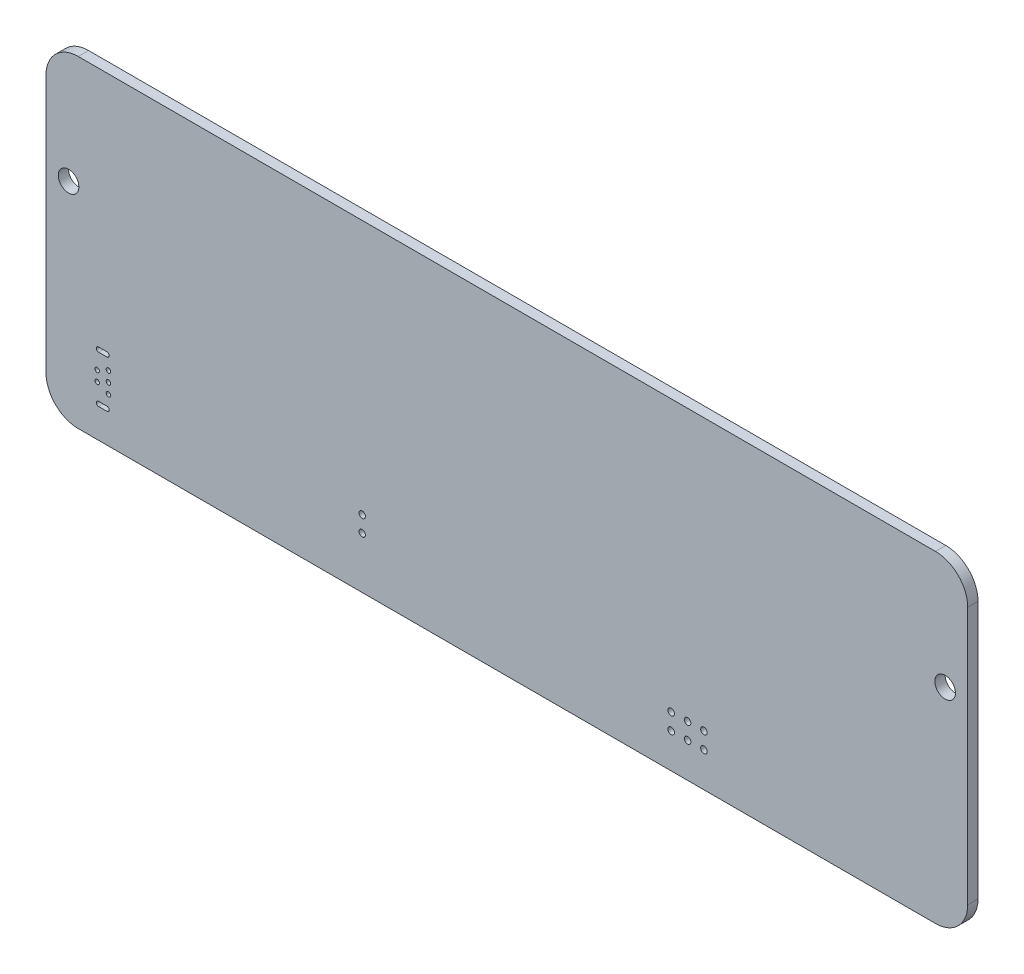
ISO-10303-21;
HEADER;
FILE_DESCRIPTION(('STEP AP214'),'2;1');
FILE_NAME('part.step','',(''),(''),'','','');
FILE_SCHEMA(('AUTOMOTIVE_DESIGN { 1 0 10303 214 1 1 1 1 }'));
ENDSEC;
DATA;
#1=APPLICATION_CONTEXT('core data for automotive mechanical design processes');
#2=APPLICATION_PROTOCOL_DEFINITION('international standard','automotive_design',2000,#1);
#3=PRODUCT_CONTEXT('',#1,'mechanical');
#4=PRODUCT('Part','Part','',(#3));
#5=PRODUCT_RELATED_PRODUCT_CATEGORY('part','',(#4));
#6=PRODUCT_DEFINITION_FORMATION('','',#4);
#7=PRODUCT_DEFINITION_CONTEXT('part definition',#1,'design');
#8=PRODUCT_DEFINITION('design','',#6,#7);
#9=PRODUCT_DEFINITION_SHAPE('','',#8);
#10=(LENGTH_UNIT() NAMED_UNIT(*) SI_UNIT(.MILLI.,.METRE.));
#11=(NAMED_UNIT(*) PLANE_ANGLE_UNIT() SI_UNIT($,.RADIAN.));
#12=(NAMED_UNIT(*) SI_UNIT($,.STERADIAN.) SOLID_ANGLE_UNIT());
#13=UNCERTAINTY_MEASURE_WITH_UNIT(LENGTH_MEASURE(1.E-05),#10,'distance_accuracy_value','');
#14=(GEOMETRIC_REPRESENTATION_CONTEXT(3) GLOBAL_UNCERTAINTY_ASSIGNED_CONTEXT((#13)) GLOBAL_UNIT_ASSIGNED_CONTEXT((#10,
#11,#12)) REPRESENTATION_CONTEXT('',''));
#15=CARTESIAN_POINT('',(0.,0.,0.));
#16=DIRECTION('',(0.,0.,1.));
#17=DIRECTION('',(1.,0.,0.));
#18=AXIS2_PLACEMENT_3D('',#15,#16,#17);
#19=CARTESIAN_POINT('',(59.465,-95.1025,0.));
#20=DIRECTION('',(0.,0.,-1.));
#21=DIRECTION('',(-1.,0.,0.));
#22=AXIS2_PLACEMENT_3D('',#19,#20,#21);
#23=CYLINDRICAL_SURFACE('',#22,0.35);
#24=CARTESIAN_POINT('',(59.465,-95.1025,1.6));
#25=DIRECTION('',(0.,0.,-1.));
#26=DIRECTION('',(-1.,0.,0.));
#27=AXIS2_PLACEMENT_3D('',#24,#25,#26);
#28=CIRCLE('',#27,0.35);
#29=CARTESIAN_POINT('',(59.465,-94.7525,1.6));
#30=VERTEX_POINT('',#29);
#31=CARTESIAN_POINT('',(59.465,-95.4525,1.6));
#32=VERTEX_POINT('',#31);
#33=EDGE_CURVE('E139',#30,#32,#28,.T.);
#34=ORIENTED_EDGE('',*,*,#33,.F.);
#35=DIRECTION('',(0.,0.,-1.));
#36=VECTOR('',#35,1.);
#37=CARTESIAN_POINT('',(59.465,-94.7525,0.));
#38=LINE('',#37,#36);
#39=CARTESIAN_POINT('',(59.465,-94.7525,0.));
#40=VERTEX_POINT('',#39);
#41=EDGE_CURVE('E134',#40,#30,#38,.F.);
#42=ORIENTED_EDGE('',*,*,#41,.F.);
#43=CARTESIAN_POINT('',(59.465,-95.1025,0.));
#44=DIRECTION('',(0.,0.,-1.));
#45=DIRECTION('',(-1.,0.,0.));
#46=AXIS2_PLACEMENT_3D('',#43,#44,#45);
#47=CIRCLE('',#46,0.35);
#48=CARTESIAN_POINT('',(59.465,-95.4525,0.));
#49=VERTEX_POINT('',#48);
#50=EDGE_CURVE('E19',#49,#40,#47,.F.);
#51=ORIENTED_EDGE('',*,*,#50,.F.);
#52=DIRECTION('',(0.,0.,1.));
#53=VECTOR('',#52,1.);
#54=CARTESIAN_POINT('',(59.465,-95.4525,0.));
#55=LINE('',#54,#53);
#56=EDGE_CURVE('E153',#32,#49,#55,.F.);
#57=ORIENTED_EDGE('',*,*,#56,.F.);
#58=EDGE_LOOP('',(#34,#42,#51,#57));
#59=FACE_BOUND('',#58,.T.);
#60=ADVANCED_FACE('F16',(#59),#23,.F.);
#61=CARTESIAN_POINT('',(58.165,-87.8025,0.));
#62=DIRECTION('',(0.,0.,-1.));
#63=DIRECTION('',(-1.,0.,0.));
#64=AXIS2_PLACEMENT_3D('',#61,#62,#63);
#65=CYLINDRICAL_SURFACE('',#64,0.35);
#66=CARTESIAN_POINT('',(58.165,-87.8025,1.6));
#67=DIRECTION('',(0.,0.,-1.));
#68=DIRECTION('',(-1.,0.,0.));
#69=AXIS2_PLACEMENT_3D('',#66,#67,#68);
#70=CIRCLE('',#69,0.35);
#71=CARTESIAN_POINT('',(58.165,-88.1525,1.6));
#72=VERTEX_POINT('',#71);
#73=CARTESIAN_POINT('',(58.165,-87.4525,1.6));
#74=VERTEX_POINT('',#73);
#75=EDGE_CURVE('E147',#72,#74,#70,.T.);
#76=ORIENTED_EDGE('',*,*,#75,.F.);
#77=DIRECTION('',(0.,0.,1.));
#78=VECTOR('',#77,1.);
#79=CARTESIAN_POINT('',(58.165,-88.1525,0.));
#80=LINE('',#79,#78);
#81=CARTESIAN_POINT('',(58.165,-88.1525,0.));
#82=VERTEX_POINT('',#81);
#83=EDGE_CURVE('E195',#82,#72,#80,.T.);
#84=ORIENTED_EDGE('',*,*,#83,.F.);
#85=CARTESIAN_POINT('',(58.165,-87.8025,0.));
#86=DIRECTION('',(0.,0.,-1.));
#87=DIRECTION('',(-1.,0.,0.));
#88=AXIS2_PLACEMENT_3D('',#85,#86,#87);
#89=CIRCLE('',#88,0.35);
#90=CARTESIAN_POINT('',(58.165,-87.4525,0.));
#91=VERTEX_POINT('',#90);
#92=EDGE_CURVE('E326',#91,#82,#89,.F.);
#93=ORIENTED_EDGE('',*,*,#92,.F.);
#94=DIRECTION('',(0.,0.,-1.));
#95=VECTOR('',#94,1.);
#96=CARTESIAN_POINT('',(58.165,-87.4525,0.));
#97=LINE('',#96,#95);
#98=EDGE_CURVE('E199',#74,#91,#97,.T.);
#99=ORIENTED_EDGE('',*,*,#98,.F.);
#100=EDGE_LOOP('',(#76,#84,#93,#99));
#101=FACE_BOUND('',#100,.T.);
#102=ADVANCED_FACE('F339',(#101),#65,.F.);
#103=CARTESIAN_POINT('',(59.465,-87.8025,0.));
#104=DIRECTION('',(0.,0.,-1.));
#105=DIRECTION('',(-1.,0.,0.));
#106=AXIS2_PLACEMENT_3D('',#103,#104,#105);
#107=CYLINDRICAL_SURFACE('',#106,0.35);
#108=CARTESIAN_POINT('',(59.465,-87.8025,1.6));
#109=DIRECTION('',(0.,0.,-1.));
#110=DIRECTION('',(-1.,0.,0.));
#111=AXIS2_PLACEMENT_3D('',#108,#109,#110);
#112=CIRCLE('',#111,0.35);
#113=CARTESIAN_POINT('',(59.465,-87.4525,1.6));
#114=VERTEX_POINT('',#113);
#115=CARTESIAN_POINT('',(59.465,-88.1525,1.6));
#116=VERTEX_POINT('',#115);
#117=EDGE_CURVE('E207',#114,#116,#112,.T.);
#118=ORIENTED_EDGE('',*,*,#117,.F.);
#119=DIRECTION('',(0.,0.,-1.));
#120=VECTOR('',#119,1.);
#121=CARTESIAN_POINT('',(59.465,-87.4525,0.));
#122=LINE('',#121,#120);
#123=CARTESIAN_POINT('',(59.465,-87.4525,0.));
#124=VERTEX_POINT('',#123);
#125=EDGE_CURVE('E200',#124,#114,#122,.F.);
#126=ORIENTED_EDGE('',*,*,#125,.F.);
#127=CARTESIAN_POINT('',(59.465,-87.8025,0.));
#128=DIRECTION('',(0.,0.,-1.));
#129=DIRECTION('',(-1.,0.,0.));
#130=AXIS2_PLACEMENT_3D('',#127,#128,#129);
#131=CIRCLE('',#130,0.35);
#132=CARTESIAN_POINT('',(59.465,-88.1525,0.));
#133=VERTEX_POINT('',#132);
#134=EDGE_CURVE('E34',#133,#124,#131,.F.);
#135=ORIENTED_EDGE('',*,*,#134,.F.);
#136=DIRECTION('',(0.,0.,1.));
#137=VECTOR('',#136,1.);
#138=CARTESIAN_POINT('',(59.465,-88.1525,0.));
#139=LINE('',#138,#137);
#140=EDGE_CURVE('E194',#116,#133,#139,.F.);
#141=ORIENTED_EDGE('',*,*,#140,.F.);
#142=EDGE_LOOP('',(#118,#126,#135,#141));
#143=FACE_BOUND('',#142,.T.);
#144=ADVANCED_FACE('F424',(#143),#107,.F.);
#145=CARTESIAN_POINT('',(121.5,-75.,1.6));
#146=DIRECTION('',(0.,0.,1.));
#147=DIRECTION('',(1.,0.,0.));
#148=AXIS2_PLACEMENT_3D('',#145,#146,#147);
#149=PLANE('',#148);
#150=CARTESIAN_POINT('',(53.5,-67.5,1.6));
#151=DIRECTION('',(0.,0.,-1.));
#152=DIRECTION('',(-1.,0.,0.));
#153=AXIS2_PLACEMENT_3D('',#150,#151,#152);
#154=CIRCLE('',#153,1.6);
#155=CARTESIAN_POINT('',(51.9,-67.5,1.6));
#156=VERTEX_POINT('',#155);
#157=EDGE_CURVE('E275',#156,#156,#154,.T.);
#158=ORIENTED_EDGE('',*,*,#157,.T.);
#159=EDGE_LOOP('',(#158));
#160=FACE_BOUND('',#159,.T.);
#161=CARTESIAN_POINT('',(189.5,-67.5,1.6));
#162=DIRECTION('',(0.,0.,-1.));
#163=DIRECTION('',(-1.,0.,0.));
#164=AXIS2_PLACEMENT_3D('',#161,#162,#163);
#165=CIRCLE('',#164,1.6);
#166=CARTESIAN_POINT('',(187.9,-67.5,1.6));
#167=VERTEX_POINT('',#166);
#168=EDGE_CURVE('E278',#167,#167,#165,.T.);
#169=ORIENTED_EDGE('',*,*,#168,.T.);
#170=EDGE_LOOP('',(#169));
#171=FACE_BOUND('',#170,.T.);
#172=ORIENTED_EDGE('',*,*,#117,.T.);
#173=DIRECTION('',(1.,0.,0.));
#174=VECTOR('',#173,1.);
#175=CARTESIAN_POINT('',(58.165,-88.1525,1.6));
#176=LINE('',#175,#174);
#177=EDGE_CURVE('E191',#72,#116,#176,.T.);
#178=ORIENTED_EDGE('',*,*,#177,.F.);
#179=ORIENTED_EDGE('',*,*,#75,.T.);
#180=DIRECTION('',(1.,0.,0.));
#181=VECTOR('',#180,1.);
#182=CARTESIAN_POINT('',(59.465,-87.4525,1.6));
#183=LINE('',#182,#181);
#184=EDGE_CURVE('E196',#114,#74,#183,.F.);
#185=ORIENTED_EDGE('',*,*,#184,.F.);
#186=EDGE_LOOP('',(#172,#178,#179,#185));
#187=FACE_BOUND('',#186,.T.);
#188=CARTESIAN_POINT('',(99.06,-89.535,1.6));
#189=DIRECTION('',(0.,0.,1.));
#190=DIRECTION('',(1.,0.,0.));
#191=AXIS2_PLACEMENT_3D('',#188,#189,#190);
#192=CIRCLE('',#191,0.5);
#193=CARTESIAN_POINT('',(99.56,-89.535,1.6));
#194=VERTEX_POINT('',#193);
#195=EDGE_CURVE('E306',#194,#194,#192,.F.);
#196=ORIENTED_EDGE('',*,*,#195,.T.);
#197=EDGE_LOOP('',(#196));
#198=FACE_BOUND('',#197,.T.);
#199=CARTESIAN_POINT('',(57.94,-90.6525,1.6));
#200=DIRECTION('',(0.,0.,1.));
#201=DIRECTION('',(1.,0.,0.));
#202=AXIS2_PLACEMENT_3D('',#199,#200,#201);
#203=CIRCLE('',#202,0.35);
#204=CARTESIAN_POINT('',(58.29,-90.6525,1.6));
#205=VERTEX_POINT('',#204);
#206=EDGE_CURVE('E300',#205,#205,#203,.F.);
#207=ORIENTED_EDGE('',*,*,#206,.T.);
#208=EDGE_LOOP('',(#207));
#209=FACE_BOUND('',#208,.T.);
#210=CARTESIAN_POINT('',(59.69,-89.8525,1.6));
#211=DIRECTION('',(0.,0.,1.));
#212=DIRECTION('',(1.,0.,0.));
#213=AXIS2_PLACEMENT_3D('',#210,#211,#212);
#214=CIRCLE('',#213,0.35);
#215=CARTESIAN_POINT('',(60.04,-89.8525,1.6));
#216=VERTEX_POINT('',#215);
#217=EDGE_CURVE('E162',#216,#216,#214,.F.);
#218=ORIENTED_EDGE('',*,*,#217,.T.);
#219=EDGE_LOOP('',(#218));
#220=FACE_BOUND('',#219,.T.);
#221=CARTESIAN_POINT('',(149.542,-94.615,1.6));
#222=DIRECTION('',(0.,0.,1.));
#223=DIRECTION('',(1.,0.,0.));
#224=AXIS2_PLACEMENT_3D('',#221,#222,#223);
#225=CIRCLE('',#224,0.508);
#226=CARTESIAN_POINT('',(150.05,-94.615,1.6));
#227=VERTEX_POINT('',#226);
#228=EDGE_CURVE('E165',#227,#227,#225,.F.);
#229=ORIENTED_EDGE('',*,*,#228,.T.);
#230=EDGE_LOOP('',(#229));
#231=FACE_BOUND('',#230,.T.);
#232=CARTESIAN_POINT('',(57.94,-92.2525,1.6));
#233=DIRECTION('',(0.,0.,1.));
#234=DIRECTION('',(1.,0.,0.));
#235=AXIS2_PLACEMENT_3D('',#232,#233,#234);
#236=CIRCLE('',#235,0.35);
#237=CARTESIAN_POINT('',(58.29,-92.2525,1.6));
#238=VERTEX_POINT('',#237);
#239=EDGE_CURVE('E297',#238,#238,#236,.F.);
#240=ORIENTED_EDGE('',*,*,#239,.T.);
#241=EDGE_LOOP('',(#240));
#242=FACE_BOUND('',#241,.T.);
#243=CARTESIAN_POINT('',(147.002,-92.075,1.6));
#244=DIRECTION('',(0.,0.,1.));
#245=DIRECTION('',(1.,0.,0.));
#246=AXIS2_PLACEMENT_3D('',#243,#244,#245);
#247=CIRCLE('',#246,0.508);
#248=CARTESIAN_POINT('',(147.51,-92.075,1.6));
#249=VERTEX_POINT('',#248);
#250=EDGE_CURVE('E312',#249,#249,#247,.F.);
#251=ORIENTED_EDGE('',*,*,#250,.T.);
#252=EDGE_LOOP('',(#251));
#253=FACE_BOUND('',#252,.T.);
#254=CARTESIAN_POINT('',(147.002,-94.615,1.6));
#255=DIRECTION('',(0.,0.,1.));
#256=DIRECTION('',(1.,0.,0.));
#257=AXIS2_PLACEMENT_3D('',#254,#255,#256);
#258=CIRCLE('',#257,0.508);
#259=CARTESIAN_POINT('',(147.51,-94.615,1.6));
#260=VERTEX_POINT('',#259);
#261=EDGE_CURVE('E315',#260,#260,#258,.F.);
#262=ORIENTED_EDGE('',*,*,#261,.T.);
#263=EDGE_LOOP('',(#262));
#264=FACE_BOUND('',#263,.T.);
#265=ORIENTED_EDGE('',*,*,#33,.T.);
#266=DIRECTION('',(1.,0.,0.));
#267=VECTOR('',#266,1.);
#268=CARTESIAN_POINT('',(58.165,-95.4525,1.6));
#269=LINE('',#268,#267);
#270=CARTESIAN_POINT('',(58.165,-95.4525,1.6));
#271=VERTEX_POINT('',#270);
#272=EDGE_CURVE('E144',#271,#32,#269,.T.);
#273=ORIENTED_EDGE('',*,*,#272,.F.);
#274=CARTESIAN_POINT('',(58.165,-95.1025,1.6));
#275=DIRECTION('',(0.,0.,-1.));
#276=DIRECTION('',(-1.,0.,0.));
#277=AXIS2_PLACEMENT_3D('',#274,#275,#276);
#278=CIRCLE('',#277,0.35);
#279=CARTESIAN_POINT('',(58.165,-94.7525,1.6));
#280=VERTEX_POINT('',#279);
#281=EDGE_CURVE('E157',#271,#280,#278,.T.);
#282=ORIENTED_EDGE('',*,*,#281,.T.);
#283=DIRECTION('',(1.,0.,0.));
#284=VECTOR('',#283,1.);
#285=CARTESIAN_POINT('',(59.465,-94.7525,1.6));
#286=LINE('',#285,#284);
#287=EDGE_CURVE('E146',#30,#280,#286,.F.);
#288=ORIENTED_EDGE('',*,*,#287,.F.);
#289=EDGE_LOOP('',(#265,#273,#282,#288));
#290=FACE_BOUND('',#289,.T.);
#291=CARTESIAN_POINT('',(152.082,-94.615,1.6));
#292=DIRECTION('',(0.,0.,1.));
#293=DIRECTION('',(1.,0.,0.));
#294=AXIS2_PLACEMENT_3D('',#291,#292,#293);
#295=CIRCLE('',#294,0.508);
#296=CARTESIAN_POINT('',(152.59,-94.615,1.6));
#297=VERTEX_POINT('',#296);
#298=EDGE_CURVE('E284',#297,#297,#295,.F.);
#299=ORIENTED_EDGE('',*,*,#298,.T.);
#300=EDGE_LOOP('',(#299));
#301=FACE_BOUND('',#300,.T.);
#302=CARTESIAN_POINT('',(99.06,-92.035,1.6));
#303=DIRECTION('',(0.,0.,1.));
#304=DIRECTION('',(1.,0.,0.));
#305=AXIS2_PLACEMENT_3D('',#302,#303,#304);
#306=CIRCLE('',#305,0.5);
#307=CARTESIAN_POINT('',(99.56,-92.035,1.6));
#308=VERTEX_POINT('',#307);
#309=EDGE_CURVE('E303',#308,#308,#306,.F.);
#310=ORIENTED_EDGE('',*,*,#309,.T.);
#311=EDGE_LOOP('',(#310));
#312=FACE_BOUND('',#311,.T.);
#313=CARTESIAN_POINT('',(59.69,-91.4525,1.6));
#314=DIRECTION('',(0.,0.,1.));
#315=DIRECTION('',(1.,0.,0.));
#316=AXIS2_PLACEMENT_3D('',#313,#314,#315);
#317=CIRCLE('',#316,0.35);
#318=CARTESIAN_POINT('',(60.04,-91.4525,1.6));
#319=VERTEX_POINT('',#318);
#320=EDGE_CURVE('E291',#319,#319,#317,.F.);
#321=ORIENTED_EDGE('',*,*,#320,.T.);
#322=EDGE_LOOP('',(#321));
#323=FACE_BOUND('',#322,.T.);
#324=CARTESIAN_POINT('',(59.69,-93.0525,1.6));
#325=DIRECTION('',(0.,0.,1.));
#326=DIRECTION('',(1.,0.,0.));
#327=AXIS2_PLACEMENT_3D('',#324,#325,#326);
#328=CIRCLE('',#327,0.35);
#329=CARTESIAN_POINT('',(60.04,-93.0525,1.6));
#330=VERTEX_POINT('',#329);
#331=EDGE_CURVE('E294',#330,#330,#328,.F.);
#332=ORIENTED_EDGE('',*,*,#331,.T.);
#333=EDGE_LOOP('',(#332));
#334=FACE_BOUND('',#333,.T.);
#335=CARTESIAN_POINT('',(149.542,-92.075,1.6));
#336=DIRECTION('',(0.,0.,1.));
#337=DIRECTION('',(1.,0.,0.));
#338=AXIS2_PLACEMENT_3D('',#335,#336,#337);
#339=CIRCLE('',#338,0.508);
#340=CARTESIAN_POINT('',(150.05,-92.075,1.6));
#341=VERTEX_POINT('',#340);
#342=EDGE_CURVE('E309',#341,#341,#339,.F.);
#343=ORIENTED_EDGE('',*,*,#342,.T.);
#344=EDGE_LOOP('',(#343));
#345=FACE_BOUND('',#344,.T.);
#346=CARTESIAN_POINT('',(152.082,-92.075,1.6));
#347=DIRECTION('',(0.,0.,1.));
#348=DIRECTION('',(1.,0.,0.));
#349=AXIS2_PLACEMENT_3D('',#346,#347,#348);
#350=CIRCLE('',#349,0.508);
#351=CARTESIAN_POINT('',(152.59,-92.075,1.6));
#352=VERTEX_POINT('',#351);
#353=EDGE_CURVE('E281',#352,#352,#350,.F.);
#354=ORIENTED_EDGE('',*,*,#353,.T.);
#355=EDGE_LOOP('',(#354));
#356=FACE_BOUND('',#355,.T.);
#357=DIRECTION('',(0.,1.,0.));
#358=VECTOR('',#357,1.);
#359=CARTESIAN_POINT('',(193.,-95.,1.6));
#360=LINE('',#359,#358);
#361=CARTESIAN_POINT('',(193.,-95.,1.6));
#362=VERTEX_POINT('',#361);
#363=CARTESIAN_POINT('',(193.,-55.,1.6));
#364=VERTEX_POINT('',#363);
#365=EDGE_CURVE('E170',#362,#364,#360,.T.);
#366=ORIENTED_EDGE('',*,*,#365,.T.);
#367=CARTESIAN_POINT('',(188.,-55.,1.6));
#368=DIRECTION('',(0.,0.,-1.));
#369=DIRECTION('',(-1.,0.,0.));
#370=AXIS2_PLACEMENT_3D('',#367,#368,#369);
#371=CIRCLE('',#370,5.);
#372=CARTESIAN_POINT('',(188.,-50.,1.6));
#373=VERTEX_POINT('',#372);
#374=EDGE_CURVE('E166',#373,#364,#371,.T.);
#375=ORIENTED_EDGE('',*,*,#374,.F.);
#376=DIRECTION('',(1.,0.,0.));
#377=VECTOR('',#376,1.);
#378=CARTESIAN_POINT('',(188.,-50.,1.6));
#379=LINE('',#378,#377);
#380=CARTESIAN_POINT('',(55.,-50.,1.6));
#381=VERTEX_POINT('',#380);
#382=EDGE_CURVE('E204',#373,#381,#379,.F.);
#383=ORIENTED_EDGE('',*,*,#382,.T.);
#384=CARTESIAN_POINT('',(55.,-55.,1.6));
#385=DIRECTION('',(0.,0.,-1.));
#386=DIRECTION('',(-1.,0.,0.));
#387=AXIS2_PLACEMENT_3D('',#384,#385,#386);
#388=CIRCLE('',#387,5.);
#389=CARTESIAN_POINT('',(50.,-55.,1.6));
#390=VERTEX_POINT('',#389);
#391=EDGE_CURVE('E190',#390,#381,#388,.T.);
#392=ORIENTED_EDGE('',*,*,#391,.F.);
#393=DIRECTION('',(0.,1.,0.));
#394=VECTOR('',#393,1.);
#395=CARTESIAN_POINT('',(50.,-55.,1.6));
#396=LINE('',#395,#394);
#397=CARTESIAN_POINT('',(50.,-95.,1.6));
#398=VERTEX_POINT('',#397);
#399=EDGE_CURVE('E187',#390,#398,#396,.F.);
#400=ORIENTED_EDGE('',*,*,#399,.T.);
#401=CARTESIAN_POINT('',(55.,-95.,1.6));
#402=DIRECTION('',(0.,0.,-1.));
#403=DIRECTION('',(-1.,0.,0.));
#404=AXIS2_PLACEMENT_3D('',#401,#402,#403);
#405=CIRCLE('',#404,5.);
#406=CARTESIAN_POINT('',(55.,-100.,1.6));
#407=VERTEX_POINT('',#406);
#408=EDGE_CURVE('E183',#407,#398,#405,.T.);
#409=ORIENTED_EDGE('',*,*,#408,.F.);
#410=DIRECTION('',(1.,0.,0.));
#411=VECTOR('',#410,1.);
#412=CARTESIAN_POINT('',(55.,-100.,1.6));
#413=LINE('',#412,#411);
#414=CARTESIAN_POINT('',(188.,-100.,1.6));
#415=VERTEX_POINT('',#414);
#416=EDGE_CURVE('E180',#407,#415,#413,.T.);
#417=ORIENTED_EDGE('',*,*,#416,.T.);
#418=CARTESIAN_POINT('',(188.,-95.,1.6));
#419=DIRECTION('',(0.,0.,-1.));
#420=DIRECTION('',(-1.,0.,0.));
#421=AXIS2_PLACEMENT_3D('',#418,#419,#420);
#422=CIRCLE('',#421,5.);
#423=EDGE_CURVE('E176',#362,#415,#422,.T.);
#424=ORIENTED_EDGE('',*,*,#423,.F.);
#425=EDGE_LOOP('',(#366,#375,#383,#392,#400,#409,#417,#424));
#426=FACE_BOUND('',#425,.T.);
#427=ADVANCED_FACE('F141',(#160,#171,#187,#198,#209,#220,#231,#242,#253,#264,#290,#301,#312,
#323,#334,#345,#356,#426),#149,.T.);
#428=CARTESIAN_POINT('',(188.,-50.,0.));
#429=DIRECTION('',(0.,-1.,0.));
#430=DIRECTION('',(0.,0.,-1.));
#431=AXIS2_PLACEMENT_3D('',#428,#429,#430);
#432=PLANE('',#431);
#433=DIRECTION('',(0.,0.,-1.));
#434=VECTOR('',#433,1.);
#435=CARTESIAN_POINT('',(55.,-50.,0.));
#436=LINE('',#435,#434);
#437=CARTESIAN_POINT('',(55.,-50.,0.));
#438=VERTEX_POINT('',#437);
#439=EDGE_CURVE('E188',#381,#438,#436,.T.);
#440=ORIENTED_EDGE('',*,*,#439,.F.);
#441=ORIENTED_EDGE('',*,*,#382,.F.);
#442=DIRECTION('',(0.,0.,-1.));
#443=VECTOR('',#442,1.);
#444=CARTESIAN_POINT('',(188.,-50.,0.));
#445=LINE('',#444,#443);
#446=CARTESIAN_POINT('',(188.,-50.,0.));
#447=VERTEX_POINT('',#446);
#448=EDGE_CURVE('E167',#447,#373,#445,.F.);
#449=ORIENTED_EDGE('',*,*,#448,.F.);
#450=DIRECTION('',(1.,0.,0.));
#451=VECTOR('',#450,1.);
#452=CARTESIAN_POINT('',(121.5,-50.,0.));
#453=LINE('',#452,#451);
#454=EDGE_CURVE('E274',#447,#438,#453,.F.);
#455=ORIENTED_EDGE('',*,*,#454,.T.);
#456=EDGE_LOOP('',(#440,#441,#449,#455));
#457=FACE_BOUND('',#456,.T.);
#458=ADVANCED_FACE('F415',(#457),#432,.F.);
#459=CARTESIAN_POINT('',(55.,-55.,0.));
#460=DIRECTION('',(0.,0.,-1.));
#461=DIRECTION('',(-1.,0.,0.));
#462=AXIS2_PLACEMENT_3D('',#459,#460,#461);
#463=CYLINDRICAL_SURFACE('',#462,5.);
#464=ORIENTED_EDGE('',*,*,#391,.T.);
#465=ORIENTED_EDGE('',*,*,#439,.T.);
#466=CARTESIAN_POINT('',(55.,-55.,0.));
#467=DIRECTION('',(0.,0.,-1.));
#468=DIRECTION('',(-1.,0.,0.));
#469=AXIS2_PLACEMENT_3D('',#466,#467,#468);
#470=CIRCLE('',#469,5.);
#471=CARTESIAN_POINT('',(50.,-55.,0.));
#472=VERTEX_POINT('',#471);
#473=EDGE_CURVE('E271',#438,#472,#470,.F.);
#474=ORIENTED_EDGE('',*,*,#473,.T.);
#475=DIRECTION('',(0.,0.,-1.));
#476=VECTOR('',#475,1.);
#477=CARTESIAN_POINT('',(50.,-55.,0.));
#478=LINE('',#477,#476);
#479=EDGE_CURVE('E184',#472,#390,#478,.F.);
#480=ORIENTED_EDGE('',*,*,#479,.T.);
#481=EDGE_LOOP('',(#464,#465,#474,#480));
#482=FACE_BOUND('',#481,.T.);
#483=ADVANCED_FACE('F412',(#482),#463,.T.);
#484=CARTESIAN_POINT('',(50.,-55.,0.));
#485=DIRECTION('',(1.,0.,0.));
#486=DIRECTION('',(0.,0.,-1.));
#487=AXIS2_PLACEMENT_3D('',#484,#485,#486);
#488=PLANE('',#487);
#489=DIRECTION('',(0.,0.,-1.));
#490=VECTOR('',#489,1.);
#491=CARTESIAN_POINT('',(50.,-95.,0.));
#492=LINE('',#491,#490);
#493=CARTESIAN_POINT('',(50.,-95.,0.));
#494=VERTEX_POINT('',#493);
#495=EDGE_CURVE('E181',#398,#494,#492,.T.);
#496=ORIENTED_EDGE('',*,*,#495,.F.);
#497=ORIENTED_EDGE('',*,*,#399,.F.);
#498=ORIENTED_EDGE('',*,*,#479,.F.);
#499=DIRECTION('',(0.,1.,0.));
#500=VECTOR('',#499,1.);
#501=CARTESIAN_POINT('',(50.,-75.,0.));
#502=LINE('',#501,#500);
#503=EDGE_CURVE('E270',#472,#494,#502,.F.);
#504=ORIENTED_EDGE('',*,*,#503,.T.);
#505=EDGE_LOOP('',(#496,#497,#498,#504));
#506=FACE_BOUND('',#505,.T.);
#507=ADVANCED_FACE('F409',(#506),#488,.F.);
#508=CARTESIAN_POINT('',(55.,-95.,0.));
#509=DIRECTION('',(0.,0.,-1.));
#510=DIRECTION('',(-1.,0.,0.));
#511=AXIS2_PLACEMENT_3D('',#508,#509,#510);
#512=CYLINDRICAL_SURFACE('',#511,5.);
#513=ORIENTED_EDGE('',*,*,#408,.T.);
#514=ORIENTED_EDGE('',*,*,#495,.T.);
#515=CARTESIAN_POINT('',(55.,-95.,0.));
#516=DIRECTION('',(0.,0.,-1.));
#517=DIRECTION('',(-1.,0.,0.));
#518=AXIS2_PLACEMENT_3D('',#515,#516,#517);
#519=CIRCLE('',#518,5.);
#520=CARTESIAN_POINT('',(55.,-100.,0.));
#521=VERTEX_POINT('',#520);
#522=EDGE_CURVE('E267',#494,#521,#519,.F.);
#523=ORIENTED_EDGE('',*,*,#522,.T.);
#524=DIRECTION('',(0.,0.,1.));
#525=VECTOR('',#524,1.);
#526=CARTESIAN_POINT('',(55.,-100.,0.));
#527=LINE('',#526,#525);
#528=EDGE_CURVE('E177',#521,#407,#527,.T.);
#529=ORIENTED_EDGE('',*,*,#528,.T.);
#530=EDGE_LOOP('',(#513,#514,#523,#529));
#531=FACE_BOUND('',#530,.T.);
#532=ADVANCED_FACE('F405',(#531),#512,.T.);
#533=CARTESIAN_POINT('',(55.,-100.,0.));
#534=DIRECTION('',(0.,1.,0.));
#535=DIRECTION('',(0.,0.,1.));
#536=AXIS2_PLACEMENT_3D('',#533,#534,#535);
#537=PLANE('',#536);
#538=DIRECTION('',(0.,0.,-1.));
#539=VECTOR('',#538,1.);
#540=CARTESIAN_POINT('',(188.,-100.,0.));
#541=LINE('',#540,#539);
#542=CARTESIAN_POINT('',(188.,-100.,0.));
#543=VERTEX_POINT('',#542);
#544=EDGE_CURVE('E174',#415,#543,#541,.T.);
#545=ORIENTED_EDGE('',*,*,#544,.F.);
#546=ORIENTED_EDGE('',*,*,#416,.F.);
#547=ORIENTED_EDGE('',*,*,#528,.F.);
#548=DIRECTION('',(1.,0.,0.));
#549=VECTOR('',#548,1.);
#550=CARTESIAN_POINT('',(121.5,-100.,0.));
#551=LINE('',#550,#549);
#552=EDGE_CURVE('E266',#521,#543,#551,.T.);
#553=ORIENTED_EDGE('',*,*,#552,.T.);
#554=EDGE_LOOP('',(#545,#546,#547,#553));
#555=FACE_BOUND('',#554,.T.);
#556=ADVANCED_FACE('F401',(#555),#537,.F.);
#557=CARTESIAN_POINT('',(188.,-95.,0.));
#558=DIRECTION('',(0.,0.,-1.));
#559=DIRECTION('',(-1.,0.,0.));
#560=AXIS2_PLACEMENT_3D('',#557,#558,#559);
#561=CYLINDRICAL_SURFACE('',#560,5.);
#562=ORIENTED_EDGE('',*,*,#423,.T.);
#563=ORIENTED_EDGE('',*,*,#544,.T.);
#564=CARTESIAN_POINT('',(188.,-95.,0.));
#565=DIRECTION('',(0.,0.,-1.));
#566=DIRECTION('',(-1.,0.,0.));
#567=AXIS2_PLACEMENT_3D('',#564,#565,#566);
#568=CIRCLE('',#567,5.);
#569=CARTESIAN_POINT('',(193.,-95.,0.));
#570=VERTEX_POINT('',#569);
#571=EDGE_CURVE('E263',#543,#570,#568,.F.);
#572=ORIENTED_EDGE('',*,*,#571,.T.);
#573=DIRECTION('',(0.,0.,1.));
#574=VECTOR('',#573,1.);
#575=CARTESIAN_POINT('',(193.,-95.,0.));
#576=LINE('',#575,#574);
#577=EDGE_CURVE('E171',#570,#362,#576,.T.);
#578=ORIENTED_EDGE('',*,*,#577,.T.);
#579=EDGE_LOOP('',(#562,#563,#572,#578));
#580=FACE_BOUND('',#579,.T.);
#581=ADVANCED_FACE('F397',(#580),#561,.T.);
#582=CARTESIAN_POINT('',(193.,-95.,0.));
#583=DIRECTION('',(-1.,0.,0.));
#584=DIRECTION('',(0.,0.,1.));
#585=AXIS2_PLACEMENT_3D('',#582,#583,#584);
#586=PLANE('',#585);
#587=DIRECTION('',(0.,0.,-1.));
#588=VECTOR('',#587,1.);
#589=CARTESIAN_POINT('',(193.,-55.,0.));
#590=LINE('',#589,#588);
#591=CARTESIAN_POINT('',(193.,-55.,0.));
#592=VERTEX_POINT('',#591);
#593=EDGE_CURVE('E163',#364,#592,#590,.T.);
#594=ORIENTED_EDGE('',*,*,#593,.F.);
#595=ORIENTED_EDGE('',*,*,#365,.F.);
#596=ORIENTED_EDGE('',*,*,#577,.F.);
#597=DIRECTION('',(0.,1.,0.));
#598=VECTOR('',#597,1.);
#599=CARTESIAN_POINT('',(193.,-75.,0.));
#600=LINE('',#599,#598);
#601=EDGE_CURVE('E262',#570,#592,#600,.T.);
#602=ORIENTED_EDGE('',*,*,#601,.T.);
#603=EDGE_LOOP('',(#594,#595,#596,#602));
#604=FACE_BOUND('',#603,.T.);
#605=ADVANCED_FACE('F421',(#604),#586,.F.);
#606=CARTESIAN_POINT('',(188.,-55.,0.));
#607=DIRECTION('',(0.,0.,-1.));
#608=DIRECTION('',(-1.,0.,0.));
#609=AXIS2_PLACEMENT_3D('',#606,#607,#608);
#610=CYLINDRICAL_SURFACE('',#609,5.);
#611=ORIENTED_EDGE('',*,*,#374,.T.);
#612=ORIENTED_EDGE('',*,*,#593,.T.);
#613=CARTESIAN_POINT('',(188.,-55.,0.));
#614=DIRECTION('',(0.,0.,-1.));
#615=DIRECTION('',(-1.,0.,0.));
#616=AXIS2_PLACEMENT_3D('',#613,#614,#615);
#617=CIRCLE('',#616,5.);
#618=EDGE_CURVE('E259',#592,#447,#617,.F.);
#619=ORIENTED_EDGE('',*,*,#618,.T.);
#620=ORIENTED_EDGE('',*,*,#448,.T.);
#621=EDGE_LOOP('',(#611,#612,#619,#620));
#622=FACE_BOUND('',#621,.T.);
#623=ADVANCED_FACE('F419',(#622),#610,.T.);
#624=CARTESIAN_POINT('',(149.542,-94.615,-0.8));
#625=DIRECTION('',(0.,0.,1.));
#626=DIRECTION('',(1.,0.,0.));
#627=AXIS2_PLACEMENT_3D('',#624,#625,#626);
#628=CYLINDRICAL_SURFACE('',#627,0.508);
#629=CARTESIAN_POINT('',(149.542,-94.615,0.));
#630=DIRECTION('',(0.,0.,1.));
#631=DIRECTION('',(1.,0.,0.));
#632=AXIS2_PLACEMENT_3D('',#629,#630,#631);
#633=CIRCLE('',#632,0.508);
#634=CARTESIAN_POINT('',(150.05,-94.615,0.));
#635=VERTEX_POINT('',#634);
#636=EDGE_CURVE('E256',#635,#635,#633,.F.);
#637=ORIENTED_EDGE('',*,*,#636,.T.);
#638=EDGE_LOOP('',(#637));
#639=FACE_BOUND('',#638,.T.);
#640=ORIENTED_EDGE('',*,*,#228,.F.);
#641=EDGE_LOOP('',(#640));
#642=FACE_BOUND('',#641,.T.);
#643=ADVANCED_FACE('F523',(#639,#642),#628,.F.);
#644=CARTESIAN_POINT('',(147.002,-94.615,-0.8));
#645=DIRECTION('',(0.,0.,1.));
#646=DIRECTION('',(1.,0.,0.));
#647=AXIS2_PLACEMENT_3D('',#644,#645,#646);
#648=CYLINDRICAL_SURFACE('',#647,0.508);
#649=CARTESIAN_POINT('',(147.002,-94.615,0.));
#650=DIRECTION('',(0.,0.,1.));
#651=DIRECTION('',(1.,0.,0.));
#652=AXIS2_PLACEMENT_3D('',#649,#650,#651);
#653=CIRCLE('',#652,0.508);
#654=CARTESIAN_POINT('',(147.51,-94.615,0.));
#655=VERTEX_POINT('',#654);
#656=EDGE_CURVE('E253',#655,#655,#653,.F.);
#657=ORIENTED_EDGE('',*,*,#656,.T.);
#658=EDGE_LOOP('',(#657));
#659=FACE_BOUND('',#658,.T.);
#660=ORIENTED_EDGE('',*,*,#261,.F.);
#661=EDGE_LOOP('',(#660));
#662=FACE_BOUND('',#661,.T.);
#663=ADVANCED_FACE('F532',(#659,#662),#648,.F.);
#664=CARTESIAN_POINT('',(147.002,-92.075,-0.8));
#665=DIRECTION('',(0.,0.,1.));
#666=DIRECTION('',(1.,0.,0.));
#667=AXIS2_PLACEMENT_3D('',#664,#665,#666);
#668=CYLINDRICAL_SURFACE('',#667,0.508);
#669=CARTESIAN_POINT('',(147.002,-92.075,0.));
#670=DIRECTION('',(0.,0.,1.));
#671=DIRECTION('',(1.,0.,0.));
#672=AXIS2_PLACEMENT_3D('',#669,#670,#671);
#673=CIRCLE('',#672,0.508);
#674=CARTESIAN_POINT('',(147.51,-92.075,0.));
#675=VERTEX_POINT('',#674);
#676=EDGE_CURVE('E250',#675,#675,#673,.F.);
#677=ORIENTED_EDGE('',*,*,#676,.T.);
#678=EDGE_LOOP('',(#677));
#679=FACE_BOUND('',#678,.T.);
#680=ORIENTED_EDGE('',*,*,#250,.F.);
#681=EDGE_LOOP('',(#680));
#682=FACE_BOUND('',#681,.T.);
#683=ADVANCED_FACE('F542',(#679,#682),#668,.F.);
#684=CARTESIAN_POINT('',(149.542,-92.075,-0.8));
#685=DIRECTION('',(0.,0.,1.));
#686=DIRECTION('',(1.,0.,0.));
#687=AXIS2_PLACEMENT_3D('',#684,#685,#686);
#688=CYLINDRICAL_SURFACE('',#687,0.508);
#689=CARTESIAN_POINT('',(149.542,-92.075,0.));
#690=DIRECTION('',(0.,0.,1.));
#691=DIRECTION('',(1.,0.,0.));
#692=AXIS2_PLACEMENT_3D('',#689,#690,#691);
#693=CIRCLE('',#692,0.508);
#694=CARTESIAN_POINT('',(150.05,-92.075,0.));
#695=VERTEX_POINT('',#694);
#696=EDGE_CURVE('E247',#695,#695,#693,.F.);
#697=ORIENTED_EDGE('',*,*,#696,.T.);
#698=EDGE_LOOP('',(#697));
#699=FACE_BOUND('',#698,.T.);
#700=ORIENTED_EDGE('',*,*,#342,.F.);
#701=EDGE_LOOP('',(#700));
#702=FACE_BOUND('',#701,.T.);
#703=ADVANCED_FACE('F552',(#699,#702),#688,.F.);
#704=CARTESIAN_POINT('',(99.06,-89.535,-0.8));
#705=DIRECTION('',(0.,0.,1.));
#706=DIRECTION('',(1.,0.,0.));
#707=AXIS2_PLACEMENT_3D('',#704,#705,#706);
#708=CYLINDRICAL_SURFACE('',#707,0.5);
#709=CARTESIAN_POINT('',(99.06,-89.535,0.));
#710=DIRECTION('',(0.,0.,1.));
#711=DIRECTION('',(1.,0.,0.));
#712=AXIS2_PLACEMENT_3D('',#709,#710,#711);
#713=CIRCLE('',#712,0.5);
#714=CARTESIAN_POINT('',(99.56,-89.535,0.));
#715=VERTEX_POINT('',#714);
#716=EDGE_CURVE('E244',#715,#715,#713,.F.);
#717=ORIENTED_EDGE('',*,*,#716,.T.);
#718=EDGE_LOOP('',(#717));
#719=FACE_BOUND('',#718,.T.);
#720=ORIENTED_EDGE('',*,*,#195,.F.);
#721=EDGE_LOOP('',(#720));
#722=FACE_BOUND('',#721,.T.);
#723=ADVANCED_FACE('F562',(#719,#722),#708,.F.);
#724=CARTESIAN_POINT('',(99.06,-92.035,-0.8));
#725=DIRECTION('',(0.,0.,1.));
#726=DIRECTION('',(1.,0.,0.));
#727=AXIS2_PLACEMENT_3D('',#724,#725,#726);
#728=CYLINDRICAL_SURFACE('',#727,0.5);
#729=CARTESIAN_POINT('',(99.06,-92.035,0.));
#730=DIRECTION('',(0.,0.,1.));
#731=DIRECTION('',(1.,0.,0.));
#732=AXIS2_PLACEMENT_3D('',#729,#730,#731);
#733=CIRCLE('',#732,0.5);
#734=CARTESIAN_POINT('',(99.56,-92.035,0.));
#735=VERTEX_POINT('',#734);
#736=EDGE_CURVE('E241',#735,#735,#733,.F.);
#737=ORIENTED_EDGE('',*,*,#736,.T.);
#738=EDGE_LOOP('',(#737));
#739=FACE_BOUND('',#738,.T.);
#740=ORIENTED_EDGE('',*,*,#309,.F.);
#741=EDGE_LOOP('',(#740));
#742=FACE_BOUND('',#741,.T.);
#743=ADVANCED_FACE('F572',(#739,#742),#728,.F.);
#744=CARTESIAN_POINT('',(57.94,-90.6525,-0.8));
#745=DIRECTION('',(0.,0.,1.));
#746=DIRECTION('',(1.,0.,0.));
#747=AXIS2_PLACEMENT_3D('',#744,#745,#746);
#748=CYLINDRICAL_SURFACE('',#747,0.35);
#749=CARTESIAN_POINT('',(57.94,-90.6525,0.));
#750=DIRECTION('',(0.,0.,1.));
#751=DIRECTION('',(1.,0.,0.));
#752=AXIS2_PLACEMENT_3D('',#749,#750,#751);
#753=CIRCLE('',#752,0.35);
#754=CARTESIAN_POINT('',(58.29,-90.6525,0.));
#755=VERTEX_POINT('',#754);
#756=EDGE_CURVE('E238',#755,#755,#753,.F.);
#757=ORIENTED_EDGE('',*,*,#756,.T.);
#758=EDGE_LOOP('',(#757));
#759=FACE_BOUND('',#758,.T.);
#760=ORIENTED_EDGE('',*,*,#206,.F.);
#761=EDGE_LOOP('',(#760));
#762=FACE_BOUND('',#761,.T.);
#763=ADVANCED_FACE('F582',(#759,#762),#748,.F.);
#764=CARTESIAN_POINT('',(57.94,-92.2525,-0.8));
#765=DIRECTION('',(0.,0.,1.));
#766=DIRECTION('',(1.,0.,0.));
#767=AXIS2_PLACEMENT_3D('',#764,#765,#766);
#768=CYLINDRICAL_SURFACE('',#767,0.35);
#769=CARTESIAN_POINT('',(57.94,-92.2525,0.));
#770=DIRECTION('',(0.,0.,1.));
#771=DIRECTION('',(1.,0.,0.));
#772=AXIS2_PLACEMENT_3D('',#769,#770,#771);
#773=CIRCLE('',#772,0.35);
#774=CARTESIAN_POINT('',(58.29,-92.2525,0.));
#775=VERTEX_POINT('',#774);
#776=EDGE_CURVE('E235',#775,#775,#773,.F.);
#777=ORIENTED_EDGE('',*,*,#776,.T.);
#778=EDGE_LOOP('',(#777));
#779=FACE_BOUND('',#778,.T.);
#780=ORIENTED_EDGE('',*,*,#239,.F.);
#781=EDGE_LOOP('',(#780));
#782=FACE_BOUND('',#781,.T.);
#783=ADVANCED_FACE('F592',(#779,#782),#768,.F.);
#784=CARTESIAN_POINT('',(59.69,-93.0525,-0.8));
#785=DIRECTION('',(0.,0.,1.));
#786=DIRECTION('',(1.,0.,0.));
#787=AXIS2_PLACEMENT_3D('',#784,#785,#786);
#788=CYLINDRICAL_SURFACE('',#787,0.35);
#789=CARTESIAN_POINT('',(59.69,-93.0525,0.));
#790=DIRECTION('',(0.,0.,1.));
#791=DIRECTION('',(1.,0.,0.));
#792=AXIS2_PLACEMENT_3D('',#789,#790,#791);
#793=CIRCLE('',#792,0.35);
#794=CARTESIAN_POINT('',(60.04,-93.0525,0.));
#795=VERTEX_POINT('',#794);
#796=EDGE_CURVE('E232',#795,#795,#793,.F.);
#797=ORIENTED_EDGE('',*,*,#796,.T.);
#798=EDGE_LOOP('',(#797));
#799=FACE_BOUND('',#798,.T.);
#800=ORIENTED_EDGE('',*,*,#331,.F.);
#801=EDGE_LOOP('',(#800));
#802=FACE_BOUND('',#801,.T.);
#803=ADVANCED_FACE('F602',(#799,#802),#788,.F.);
#804=CARTESIAN_POINT('',(59.69,-91.4525,-0.8));
#805=DIRECTION('',(0.,0.,1.));
#806=DIRECTION('',(1.,0.,0.));
#807=AXIS2_PLACEMENT_3D('',#804,#805,#806);
#808=CYLINDRICAL_SURFACE('',#807,0.35);
#809=CARTESIAN_POINT('',(59.69,-91.4525,0.));
#810=DIRECTION('',(0.,0.,1.));
#811=DIRECTION('',(1.,0.,0.));
#812=AXIS2_PLACEMENT_3D('',#809,#810,#811);
#813=CIRCLE('',#812,0.35);
#814=CARTESIAN_POINT('',(60.04,-91.4525,0.));
#815=VERTEX_POINT('',#814);
#816=EDGE_CURVE('E229',#815,#815,#813,.F.);
#817=ORIENTED_EDGE('',*,*,#816,.T.);
#818=EDGE_LOOP('',(#817));
#819=FACE_BOUND('',#818,.T.);
#820=ORIENTED_EDGE('',*,*,#320,.F.);
#821=EDGE_LOOP('',(#820));
#822=FACE_BOUND('',#821,.T.);
#823=ADVANCED_FACE('F612',(#819,#822),#808,.F.);
#824=CARTESIAN_POINT('',(59.69,-89.8525,-0.8));
#825=DIRECTION('',(0.,0.,1.));
#826=DIRECTION('',(1.,0.,0.));
#827=AXIS2_PLACEMENT_3D('',#824,#825,#826);
#828=CYLINDRICAL_SURFACE('',#827,0.35);
#829=CARTESIAN_POINT('',(59.69,-89.8525,0.));
#830=DIRECTION('',(0.,0.,1.));
#831=DIRECTION('',(1.,0.,0.));
#832=AXIS2_PLACEMENT_3D('',#829,#830,#831);
#833=CIRCLE('',#832,0.35);
#834=CARTESIAN_POINT('',(60.04,-89.8525,0.));
#835=VERTEX_POINT('',#834);
#836=EDGE_CURVE('E226',#835,#835,#833,.F.);
#837=ORIENTED_EDGE('',*,*,#836,.T.);
#838=EDGE_LOOP('',(#837));
#839=FACE_BOUND('',#838,.T.);
#840=ORIENTED_EDGE('',*,*,#217,.F.);
#841=EDGE_LOOP('',(#840));
#842=FACE_BOUND('',#841,.T.);
#843=ADVANCED_FACE('F622',(#839,#842),#828,.F.);
#844=CARTESIAN_POINT('',(59.465,-94.7525,0.));
#845=DIRECTION('',(0.,-1.,0.));
#846=DIRECTION('',(0.,0.,-1.));
#847=AXIS2_PLACEMENT_3D('',#844,#845,#846);
#848=PLANE('',#847);
#849=DIRECTION('',(0.,0.,-1.));
#850=VECTOR('',#849,1.);
#851=CARTESIAN_POINT('',(58.165,-94.7525,0.));
#852=LINE('',#851,#850);
#853=CARTESIAN_POINT('',(58.165,-94.7525,0.));
#854=VERTEX_POINT('',#853);
#855=EDGE_CURVE('E287',#280,#854,#852,.T.);
#856=ORIENTED_EDGE('',*,*,#855,.T.);
#857=DIRECTION('',(1.,0.,0.));
#858=VECTOR('',#857,1.);
#859=CARTESIAN_POINT('',(121.5,-94.7525,0.));
#860=LINE('',#859,#858);
#861=EDGE_CURVE('E64',#854,#40,#860,.T.);
#862=ORIENTED_EDGE('',*,*,#861,.T.);
#863=ORIENTED_EDGE('',*,*,#41,.T.);
#864=ORIENTED_EDGE('',*,*,#287,.T.);
#865=EDGE_LOOP('',(#856,#862,#863,#864));
#866=FACE_BOUND('',#865,.T.);
#867=ADVANCED_FACE('F360',(#866),#848,.T.);
#868=CARTESIAN_POINT('',(58.165,-95.4525,0.));
#869=DIRECTION('',(0.,1.,0.));
#870=DIRECTION('',(0.,0.,1.));
#871=AXIS2_PLACEMENT_3D('',#868,#869,#870);
#872=PLANE('',#871);
#873=ORIENTED_EDGE('',*,*,#56,.T.);
#874=DIRECTION('',(1.,0.,0.));
#875=VECTOR('',#874,1.);
#876=CARTESIAN_POINT('',(121.5,-95.4525,0.));
#877=LINE('',#876,#875);
#878=CARTESIAN_POINT('',(58.165,-95.4525,0.));
#879=VERTEX_POINT('',#878);
#880=EDGE_CURVE('E225',#49,#879,#877,.F.);
#881=ORIENTED_EDGE('',*,*,#880,.T.);
#882=DIRECTION('',(0.,0.,-1.));
#883=VECTOR('',#882,1.);
#884=CARTESIAN_POINT('',(58.165,-95.4525,0.));
#885=LINE('',#884,#883);
#886=EDGE_CURVE('E154',#879,#271,#885,.F.);
#887=ORIENTED_EDGE('',*,*,#886,.T.);
#888=ORIENTED_EDGE('',*,*,#272,.T.);
#889=EDGE_LOOP('',(#873,#881,#887,#888));
#890=FACE_BOUND('',#889,.T.);
#891=ADVANCED_FACE('F151',(#890),#872,.T.);
#892=CARTESIAN_POINT('',(58.165,-95.1025,0.));
#893=DIRECTION('',(0.,0.,-1.));
#894=DIRECTION('',(-1.,0.,0.));
#895=AXIS2_PLACEMENT_3D('',#892,#893,#894);
#896=CYLINDRICAL_SURFACE('',#895,0.35);
#897=ORIENTED_EDGE('',*,*,#281,.F.);
#898=ORIENTED_EDGE('',*,*,#886,.F.);
#899=CARTESIAN_POINT('',(58.165,-95.1025,0.));
#900=DIRECTION('',(0.,0.,-1.));
#901=DIRECTION('',(-1.,0.,0.));
#902=AXIS2_PLACEMENT_3D('',#899,#900,#901);
#903=CIRCLE('',#902,0.35);
#904=EDGE_CURVE('E222',#879,#854,#903,.T.);
#905=ORIENTED_EDGE('',*,*,#904,.T.);
#906=ORIENTED_EDGE('',*,*,#855,.F.);
#907=EDGE_LOOP('',(#897,#898,#905,#906));
#908=FACE_BOUND('',#907,.T.);
#909=ADVANCED_FACE('F362',(#908),#896,.F.);
#910=CARTESIAN_POINT('',(152.082,-94.615,-0.8));
#911=DIRECTION('',(0.,0.,1.));
#912=DIRECTION('',(1.,0.,0.));
#913=AXIS2_PLACEMENT_3D('',#910,#911,#912);
#914=CYLINDRICAL_SURFACE('',#913,0.508);
#915=CARTESIAN_POINT('',(152.082,-94.615,0.));
#916=DIRECTION('',(0.,0.,1.));
#917=DIRECTION('',(1.,0.,0.));
#918=AXIS2_PLACEMENT_3D('',#915,#916,#917);
#919=CIRCLE('',#918,0.508);
#920=CARTESIAN_POINT('',(152.59,-94.615,0.));
#921=VERTEX_POINT('',#920);
#922=EDGE_CURVE('E219',#921,#921,#919,.F.);
#923=ORIENTED_EDGE('',*,*,#922,.T.);
#924=EDGE_LOOP('',(#923));
#925=FACE_BOUND('',#924,.T.);
#926=ORIENTED_EDGE('',*,*,#298,.F.);
#927=EDGE_LOOP('',(#926));
#928=FACE_BOUND('',#927,.T.);
#929=ADVANCED_FACE('F657',(#925,#928),#914,.F.);
#930=CARTESIAN_POINT('',(152.082,-92.075,-0.8));
#931=DIRECTION('',(0.,0.,1.));
#932=DIRECTION('',(1.,0.,0.));
#933=AXIS2_PLACEMENT_3D('',#930,#931,#932);
#934=CYLINDRICAL_SURFACE('',#933,0.508);
#935=CARTESIAN_POINT('',(152.082,-92.075,0.));
#936=DIRECTION('',(0.,0.,1.));
#937=DIRECTION('',(1.,0.,0.));
#938=AXIS2_PLACEMENT_3D('',#935,#936,#937);
#939=CIRCLE('',#938,0.508);
#940=CARTESIAN_POINT('',(152.59,-92.075,0.));
#941=VERTEX_POINT('',#940);
#942=EDGE_CURVE('E215',#941,#941,#939,.F.);
#943=ORIENTED_EDGE('',*,*,#942,.T.);
#944=EDGE_LOOP('',(#943));
#945=FACE_BOUND('',#944,.T.);
#946=ORIENTED_EDGE('',*,*,#353,.F.);
#947=EDGE_LOOP('',(#946));
#948=FACE_BOUND('',#947,.T.);
#949=ADVANCED_FACE('F666',(#945,#948),#934,.F.);
#950=CARTESIAN_POINT('',(59.465,-87.4525,0.));
#951=DIRECTION('',(0.,-1.,0.));
#952=DIRECTION('',(0.,0.,-1.));
#953=AXIS2_PLACEMENT_3D('',#950,#951,#952);
#954=PLANE('',#953);
#955=ORIENTED_EDGE('',*,*,#98,.T.);
#956=DIRECTION('',(1.,0.,0.));
#957=VECTOR('',#956,1.);
#958=CARTESIAN_POINT('',(121.5,-87.4525,0.));
#959=LINE('',#958,#957);
#960=EDGE_CURVE('E218',#91,#124,#959,.T.);
#961=ORIENTED_EDGE('',*,*,#960,.T.);
#962=ORIENTED_EDGE('',*,*,#125,.T.);
#963=ORIENTED_EDGE('',*,*,#184,.T.);
#964=EDGE_LOOP('',(#955,#961,#962,#963));
#965=FACE_BOUND('',#964,.T.);
#966=ADVANCED_FACE('F676',(#965),#954,.T.);
#967=CARTESIAN_POINT('',(58.165,-88.1525,0.));
#968=DIRECTION('',(0.,1.,0.));
#969=DIRECTION('',(0.,0.,1.));
#970=AXIS2_PLACEMENT_3D('',#967,#968,#969);
#971=PLANE('',#970);
#972=ORIENTED_EDGE('',*,*,#140,.T.);
#973=DIRECTION('',(1.,0.,0.));
#974=VECTOR('',#973,1.);
#975=CARTESIAN_POINT('',(121.5,-88.1525,0.));
#976=LINE('',#975,#974);
#977=EDGE_CURVE('E214',#133,#82,#976,.F.);
#978=ORIENTED_EDGE('',*,*,#977,.T.);
#979=ORIENTED_EDGE('',*,*,#83,.T.);
#980=ORIENTED_EDGE('',*,*,#177,.T.);
#981=EDGE_LOOP('',(#972,#978,#979,#980));
#982=FACE_BOUND('',#981,.T.);
#983=ADVANCED_FACE('F343',(#982),#971,.T.);
#984=CARTESIAN_POINT('',(189.5,-67.5,0.));
#985=DIRECTION('',(0.,0.,-1.));
#986=DIRECTION('',(-1.,0.,0.));
#987=AXIS2_PLACEMENT_3D('',#984,#985,#986);
#988=CYLINDRICAL_SURFACE('',#987,1.6);
#989=ORIENTED_EDGE('',*,*,#168,.F.);
#990=EDGE_LOOP('',(#989));
#991=FACE_BOUND('',#990,.T.);
#992=CARTESIAN_POINT('',(189.5,-67.5,0.));
#993=DIRECTION('',(0.,0.,-1.));
#994=DIRECTION('',(-1.,0.,0.));
#995=AXIS2_PLACEMENT_3D('',#992,#993,#994);
#996=CIRCLE('',#995,1.6);
#997=CARTESIAN_POINT('',(187.9,-67.5,0.));
#998=VERTEX_POINT('',#997);
#999=EDGE_CURVE('E25',#998,#998,#996,.T.);
#1000=ORIENTED_EDGE('',*,*,#999,.T.);
#1001=EDGE_LOOP('',(#1000));
#1002=FACE_BOUND('',#1001,.T.);
#1003=ADVANCED_FACE('F695',(#991,#1002),#988,.F.);
#1004=CARTESIAN_POINT('',(53.5,-67.5,0.));
#1005=DIRECTION('',(0.,0.,-1.));
#1006=DIRECTION('',(-1.,0.,0.));
#1007=AXIS2_PLACEMENT_3D('',#1004,#1005,#1006);
#1008=CYLINDRICAL_SURFACE('',#1007,1.6);
#1009=ORIENTED_EDGE('',*,*,#157,.F.);
#1010=EDGE_LOOP('',(#1009));
#1011=FACE_BOUND('',#1010,.T.);
#1012=CARTESIAN_POINT('',(53.5,-67.5,0.));
#1013=DIRECTION('',(0.,0.,-1.));
#1014=DIRECTION('',(-1.,0.,0.));
#1015=AXIS2_PLACEMENT_3D('',#1012,#1013,#1014);
#1016=CIRCLE('',#1015,1.6);
#1017=CARTESIAN_POINT('',(51.9,-67.5,0.));
#1018=VERTEX_POINT('',#1017);
#1019=EDGE_CURVE('E10',#1018,#1018,#1016,.T.);
#1020=ORIENTED_EDGE('',*,*,#1019,.T.);
#1021=EDGE_LOOP('',(#1020));
#1022=FACE_BOUND('',#1021,.T.);
#1023=ADVANCED_FACE('F365',(#1011,#1022),#1008,.F.);
#1024=CARTESIAN_POINT('',(121.5,-75.,0.));
#1025=DIRECTION('',(0.,0.,1.));
#1026=DIRECTION('',(1.,0.,0.));
#1027=AXIS2_PLACEMENT_3D('',#1024,#1025,#1026);
#1028=PLANE('',#1027);
#1029=ORIENTED_EDGE('',*,*,#1019,.F.);
#1030=EDGE_LOOP('',(#1029));
#1031=FACE_BOUND('',#1030,.T.);
#1032=ORIENTED_EDGE('',*,*,#999,.F.);
#1033=EDGE_LOOP('',(#1032));
#1034=FACE_BOUND('',#1033,.T.);
#1035=ORIENTED_EDGE('',*,*,#134,.T.);
#1036=ORIENTED_EDGE('',*,*,#960,.F.);
#1037=ORIENTED_EDGE('',*,*,#92,.T.);
#1038=ORIENTED_EDGE('',*,*,#977,.F.);
#1039=EDGE_LOOP('',(#1035,#1036,#1037,#1038));
#1040=FACE_BOUND('',#1039,.T.);
#1041=ORIENTED_EDGE('',*,*,#942,.F.);
#1042=EDGE_LOOP('',(#1041));
#1043=FACE_BOUND('',#1042,.T.);
#1044=ORIENTED_EDGE('',*,*,#922,.F.);
#1045=EDGE_LOOP('',(#1044));
#1046=FACE_BOUND('',#1045,.T.);
#1047=ORIENTED_EDGE('',*,*,#880,.F.);
#1048=ORIENTED_EDGE('',*,*,#50,.T.);
#1049=ORIENTED_EDGE('',*,*,#861,.F.);
#1050=ORIENTED_EDGE('',*,*,#904,.F.);
#1051=EDGE_LOOP('',(#1047,#1048,#1049,#1050));
#1052=FACE_BOUND('',#1051,.T.);
#1053=ORIENTED_EDGE('',*,*,#836,.F.);
#1054=EDGE_LOOP('',(#1053));
#1055=FACE_BOUND('',#1054,.T.);
#1056=ORIENTED_EDGE('',*,*,#816,.F.);
#1057=EDGE_LOOP('',(#1056));
#1058=FACE_BOUND('',#1057,.T.);
#1059=ORIENTED_EDGE('',*,*,#796,.F.);
#1060=EDGE_LOOP('',(#1059));
#1061=FACE_BOUND('',#1060,.T.);
#1062=ORIENTED_EDGE('',*,*,#776,.F.);
#1063=EDGE_LOOP('',(#1062));
#1064=FACE_BOUND('',#1063,.T.);
#1065=ORIENTED_EDGE('',*,*,#756,.F.);
#1066=EDGE_LOOP('',(#1065));
#1067=FACE_BOUND('',#1066,.T.);
#1068=ORIENTED_EDGE('',*,*,#736,.F.);
#1069=EDGE_LOOP('',(#1068));
#1070=FACE_BOUND('',#1069,.T.);
#1071=ORIENTED_EDGE('',*,*,#716,.F.);
#1072=EDGE_LOOP('',(#1071));
#1073=FACE_BOUND('',#1072,.T.);
#1074=ORIENTED_EDGE('',*,*,#696,.F.);
#1075=EDGE_LOOP('',(#1074));
#1076=FACE_BOUND('',#1075,.T.);
#1077=ORIENTED_EDGE('',*,*,#676,.F.);
#1078=EDGE_LOOP('',(#1077));
#1079=FACE_BOUND('',#1078,.T.);
#1080=ORIENTED_EDGE('',*,*,#656,.F.);
#1081=EDGE_LOOP('',(#1080));
#1082=FACE_BOUND('',#1081,.T.);
#1083=ORIENTED_EDGE('',*,*,#636,.F.);
#1084=EDGE_LOOP('',(#1083));
#1085=FACE_BOUND('',#1084,.T.);
#1086=ORIENTED_EDGE('',*,*,#601,.F.);
#1087=ORIENTED_EDGE('',*,*,#571,.F.);
#1088=ORIENTED_EDGE('',*,*,#552,.F.);
#1089=ORIENTED_EDGE('',*,*,#522,.F.);
#1090=ORIENTED_EDGE('',*,*,#503,.F.);
#1091=ORIENTED_EDGE('',*,*,#473,.F.);
#1092=ORIENTED_EDGE('',*,*,#454,.F.);
#1093=ORIENTED_EDGE('',*,*,#618,.F.);
#1094=EDGE_LOOP('',(#1086,#1087,#1088,#1089,#1090,#1091,#1092,#1093));
#1095=FACE_BOUND('',#1094,.T.);
#1096=ADVANCED_FACE('F331',(#1031,#1034,#1040,#1043,#1046,#1052,#1055,#1058,#1061,#1064,#1067,
#1070,#1073,#1076,#1079,#1082,#1085,#1095),#1028,.F.);
#1097=CLOSED_SHELL('',(#60,#102,#144,#427,#458,#483,#507,#532,#556,#581,#605,#623,#643,#663,
#683,#703,#723,#743,#763,#783,#803,#823,#843,#867,#891,#909,#929,#949,#966,#983,#1003,#1023,#1096));
#1098=MANIFOLD_SOLID_BREP('B1',#1097);
#1099=ADVANCED_BREP_SHAPE_REPRESENTATION('',(#18,#1098),#14);
#1100=SHAPE_DEFINITION_REPRESENTATION(#9,#1099);
ENDSEC;
END-ISO-10303-21;
